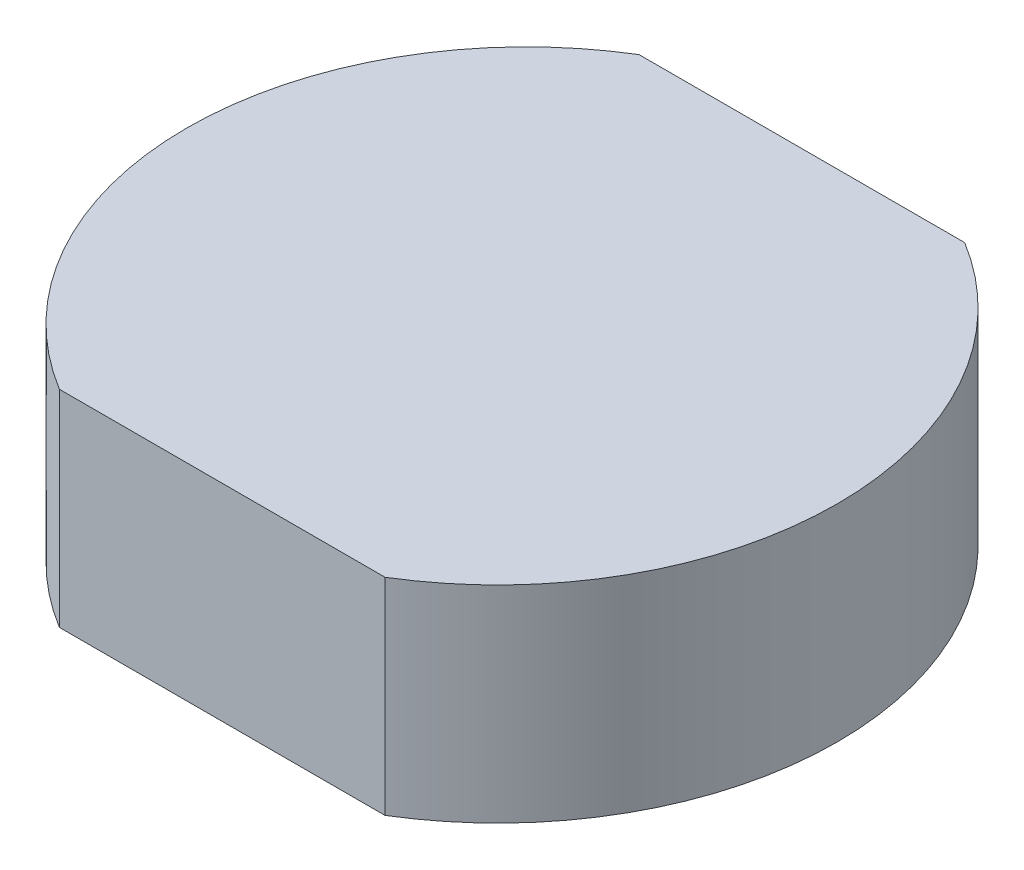
ISO-10303-21;
HEADER;
FILE_DESCRIPTION(('STEP AP214'),'2;1');
FILE_NAME('part.step','',(''),(''),'','','');
FILE_SCHEMA(('AUTOMOTIVE_DESIGN { 1 0 10303 214 1 1 1 1 }'));
ENDSEC;
DATA;
#1=APPLICATION_CONTEXT('core data for automotive mechanical design processes');
#2=APPLICATION_PROTOCOL_DEFINITION('international standard','automotive_design',2000,#1);
#3=PRODUCT_CONTEXT('',#1,'mechanical');
#4=PRODUCT('Part','Part','',(#3));
#5=PRODUCT_RELATED_PRODUCT_CATEGORY('part','',(#4));
#6=PRODUCT_DEFINITION_FORMATION('','',#4);
#7=PRODUCT_DEFINITION_CONTEXT('part definition',#1,'design');
#8=PRODUCT_DEFINITION('design','',#6,#7);
#9=PRODUCT_DEFINITION_SHAPE('','',#8);
#10=(LENGTH_UNIT() NAMED_UNIT(*) SI_UNIT(.MILLI.,.METRE.));
#11=(NAMED_UNIT(*) PLANE_ANGLE_UNIT() SI_UNIT($,.RADIAN.));
#12=(NAMED_UNIT(*) SI_UNIT($,.STERADIAN.) SOLID_ANGLE_UNIT());
#13=UNCERTAINTY_MEASURE_WITH_UNIT(LENGTH_MEASURE(1.E-05),#10,'distance_accuracy_value','');
#14=(GEOMETRIC_REPRESENTATION_CONTEXT(3) GLOBAL_UNCERTAINTY_ASSIGNED_CONTEXT((#13)) GLOBAL_UNIT_ASSIGNED_CONTEXT((#10,
#11,#12)) REPRESENTATION_CONTEXT('',''));
#15=CARTESIAN_POINT('',(0.,0.,0.));
#16=DIRECTION('',(0.,0.,1.));
#17=DIRECTION('',(1.,0.,0.));
#18=AXIS2_PLACEMENT_3D('',#15,#16,#17);
#19=CARTESIAN_POINT('',(0.,5.,-7.35));
#20=DIRECTION('',(0.,0.,1.));
#21=DIRECTION('',(1.,0.,0.));
#22=AXIS2_PLACEMENT_3D('',#19,#20,#21);
#23=PLANE('',#22);
#24=DIRECTION('',(-1.,0.,0.));
#25=VECTOR('',#24,1.);
#26=CARTESIAN_POINT('',(0.,0.,-7.35));
#27=LINE('',#26,#25);
#28=CARTESIAN_POINT('',(4.34763098818769,0.,-7.35));
#29=VERTEX_POINT('',#28);
#30=CARTESIAN_POINT('',(-4.34763098818769,0.,-7.35));
#31=VERTEX_POINT('',#30);
#32=EDGE_CURVE('E133',#29,#31,#27,.T.);
#33=ORIENTED_EDGE('',*,*,#32,.F.);
#34=DIRECTION('',(0.,-1.,0.));
#35=VECTOR('',#34,1.);
#36=CARTESIAN_POINT('',(4.34763098818769,5.,-7.35));
#37=LINE('',#36,#35);
#38=CARTESIAN_POINT('',(4.34763098818769,5.,-7.35));
#39=VERTEX_POINT('',#38);
#40=EDGE_CURVE('E144',#39,#29,#37,.T.);
#41=ORIENTED_EDGE('',*,*,#40,.F.);
#42=DIRECTION('',(-1.,0.,0.));
#43=VECTOR('',#42,1.);
#44=CARTESIAN_POINT('',(0.,5.,-7.35));
#45=LINE('',#44,#43);
#46=CARTESIAN_POINT('',(-4.34763098818769,5.,-7.35));
#47=VERTEX_POINT('',#46);
#48=EDGE_CURVE('E138',#39,#47,#45,.T.);
#49=ORIENTED_EDGE('',*,*,#48,.T.);
#50=DIRECTION('',(0.,-1.,0.));
#51=VECTOR('',#50,1.);
#52=CARTESIAN_POINT('',(-4.34763098818769,5.,-7.35));
#53=LINE('',#52,#51);
#54=EDGE_CURVE('E124',#47,#31,#53,.T.);
#55=ORIENTED_EDGE('',*,*,#54,.T.);
#56=EDGE_LOOP('',(#33,#41,#49,#55));
#57=FACE_BOUND('',#56,.T.);
#58=ADVANCED_FACE('F41',(#57),#23,.T.);
#59=CARTESIAN_POINT('',(-0.4,5.,0.));
#60=DIRECTION('',(0.,-1.,0.));
#61=DIRECTION('',(0.,0.,-1.));
#62=AXIS2_PLACEMENT_3D('',#59,#60,#61);
#63=CYLINDRICAL_SURFACE('',#62,8.75);
#64=CARTESIAN_POINT('',(-0.4,0.,0.));
#65=DIRECTION('',(0.,1.,0.));
#66=DIRECTION('',(0.,0.,1.));
#67=AXIS2_PLACEMENT_3D('',#64,#65,#66);
#68=CIRCLE('',#67,8.75);
#69=CARTESIAN_POINT('',(4.34763098818769,0.,7.35));
#70=VERTEX_POINT('',#69);
#71=EDGE_CURVE('E130',#29,#70,#68,.F.);
#72=ORIENTED_EDGE('',*,*,#71,.T.);
#73=DIRECTION('',(0.,-1.,0.));
#74=VECTOR('',#73,1.);
#75=CARTESIAN_POINT('',(4.34763098818769,5.,7.35));
#76=LINE('',#75,#74);
#77=CARTESIAN_POINT('',(4.34763098818769,5.,7.35));
#78=VERTEX_POINT('',#77);
#79=EDGE_CURVE('E123',#78,#70,#76,.T.);
#80=ORIENTED_EDGE('',*,*,#79,.F.);
#81=CARTESIAN_POINT('',(-0.4,5.,0.));
#82=DIRECTION('',(0.,1.,0.));
#83=DIRECTION('',(0.,0.,1.));
#84=AXIS2_PLACEMENT_3D('',#81,#82,#83);
#85=CIRCLE('',#84,8.75);
#86=EDGE_CURVE('E287',#39,#78,#85,.F.);
#87=ORIENTED_EDGE('',*,*,#86,.F.);
#88=ORIENTED_EDGE('',*,*,#40,.T.);
#89=EDGE_LOOP('',(#72,#80,#87,#88));
#90=FACE_BOUND('',#89,.T.);
#91=ADVANCED_FACE('F254',(#90),#63,.F.);
#92=CARTESIAN_POINT('',(0.,5.,7.35));
#93=DIRECTION('',(0.,0.,1.));
#94=DIRECTION('',(1.,0.,0.));
#95=AXIS2_PLACEMENT_3D('',#92,#93,#94);
#96=PLANE('',#95);
#97=DIRECTION('',(-1.,0.,0.));
#98=VECTOR('',#97,1.);
#99=CARTESIAN_POINT('',(0.,0.,7.35));
#100=LINE('',#99,#98);
#101=CARTESIAN_POINT('',(-4.34763098818769,0.,7.35));
#102=VERTEX_POINT('',#101);
#103=EDGE_CURVE('E107',#70,#102,#100,.T.);
#104=ORIENTED_EDGE('',*,*,#103,.T.);
#105=DIRECTION('',(0.,-1.,0.));
#106=VECTOR('',#105,1.);
#107=CARTESIAN_POINT('',(-4.34763098818769,5.,7.35));
#108=LINE('',#107,#106);
#109=CARTESIAN_POINT('',(-4.34763098818769,5.,7.35));
#110=VERTEX_POINT('',#109);
#111=EDGE_CURVE('E116',#110,#102,#108,.T.);
#112=ORIENTED_EDGE('',*,*,#111,.F.);
#113=DIRECTION('',(-1.,0.,0.));
#114=VECTOR('',#113,1.);
#115=CARTESIAN_POINT('',(0.,5.,7.35));
#116=LINE('',#115,#114);
#117=EDGE_CURVE('E72',#78,#110,#116,.T.);
#118=ORIENTED_EDGE('',*,*,#117,.F.);
#119=ORIENTED_EDGE('',*,*,#79,.T.);
#120=EDGE_LOOP('',(#104,#112,#118,#119));
#121=FACE_BOUND('',#120,.T.);
#122=ADVANCED_FACE('F126',(#121),#96,.F.);
#123=CARTESIAN_POINT('',(-0.399999999999998,5.,0.));
#124=DIRECTION('',(0.,-1.,0.));
#125=DIRECTION('',(0.,0.,-1.));
#126=AXIS2_PLACEMENT_3D('',#123,#124,#125);
#127=CYLINDRICAL_SURFACE('',#126,9.55);
#128=CARTESIAN_POINT('',(-0.399999999999998,0.,0.));
#129=DIRECTION('',(0.,1.,0.));
#130=DIRECTION('',(0.,0.,1.));
#131=AXIS2_PLACEMENT_3D('',#128,#129,#130);
#132=CIRCLE('',#131,9.55);
#133=CARTESIAN_POINT('',(4.57795138586146,0.,-8.15));
#134=VERTEX_POINT('',#133);
#135=CARTESIAN_POINT('',(4.57795138586146,0.,8.15));
#136=VERTEX_POINT('',#135);
#137=EDGE_CURVE('E273',#134,#136,#132,.F.);
#138=ORIENTED_EDGE('',*,*,#137,.F.);
#139=DIRECTION('',(0.,-1.,0.));
#140=VECTOR('',#139,1.);
#141=CARTESIAN_POINT('',(4.57795138586146,5.,-8.15));
#142=LINE('',#141,#140);
#143=CARTESIAN_POINT('',(4.57795138586146,5.8,-8.15));
#144=VERTEX_POINT('',#143);
#145=EDGE_CURVE('E140',#144,#134,#142,.T.);
#146=ORIENTED_EDGE('',*,*,#145,.F.);
#147=CARTESIAN_POINT('',(-0.399999999999998,5.8,0.));
#148=DIRECTION('',(0.,1.,0.));
#149=DIRECTION('',(0.,0.,1.));
#150=AXIS2_PLACEMENT_3D('',#147,#148,#149);
#151=CIRCLE('',#150,9.55);
#152=CARTESIAN_POINT('',(4.57795138586146,5.8,8.15));
#153=VERTEX_POINT('',#152);
#154=EDGE_CURVE('E226',#153,#144,#151,.T.);
#155=ORIENTED_EDGE('',*,*,#154,.F.);
#156=DIRECTION('',(0.,-1.,0.));
#157=VECTOR('',#156,1.);
#158=CARTESIAN_POINT('',(4.57795138586146,5.,8.15));
#159=LINE('',#158,#157);
#160=EDGE_CURVE('E147',#153,#136,#159,.T.);
#161=ORIENTED_EDGE('',*,*,#160,.T.);
#162=EDGE_LOOP('',(#138,#146,#155,#161));
#163=FACE_BOUND('',#162,.T.);
#164=ADVANCED_FACE('F43',(#163),#127,.T.);
#165=CARTESIAN_POINT('',(0.,5.,-8.15));
#166=DIRECTION('',(0.,0.,1.));
#167=DIRECTION('',(1.,0.,0.));
#168=AXIS2_PLACEMENT_3D('',#165,#166,#167);
#169=PLANE('',#168);
#170=DIRECTION('',(-1.,0.,0.));
#171=VECTOR('',#170,1.);
#172=CARTESIAN_POINT('',(0.,0.,-8.15));
#173=LINE('',#172,#171);
#174=CARTESIAN_POINT('',(-4.57795138586146,0.,-8.15));
#175=VERTEX_POINT('',#174);
#176=EDGE_CURVE('E193',#134,#175,#173,.T.);
#177=ORIENTED_EDGE('',*,*,#176,.T.);
#178=DIRECTION('',(0.,-1.,0.));
#179=VECTOR('',#178,1.);
#180=CARTESIAN_POINT('',(-4.57795138586146,5.,-8.15));
#181=LINE('',#180,#179);
#182=CARTESIAN_POINT('',(-4.57795138586146,5.8,-8.15));
#183=VERTEX_POINT('',#182);
#184=EDGE_CURVE('E154',#183,#175,#181,.T.);
#185=ORIENTED_EDGE('',*,*,#184,.F.);
#186=DIRECTION('',(-1.,0.,0.));
#187=VECTOR('',#186,1.);
#188=CARTESIAN_POINT('',(4.57795138586146,5.8,-8.15));
#189=LINE('',#188,#187);
#190=EDGE_CURVE('E294',#144,#183,#189,.T.);
#191=ORIENTED_EDGE('',*,*,#190,.F.);
#192=ORIENTED_EDGE('',*,*,#145,.T.);
#193=EDGE_LOOP('',(#177,#185,#191,#192));
#194=FACE_BOUND('',#193,.T.);
#195=ADVANCED_FACE('F264',(#194),#169,.F.);
#196=CARTESIAN_POINT('',(0.4,5.,0.));
#197=DIRECTION('',(0.,-1.,0.));
#198=DIRECTION('',(0.,0.,-1.));
#199=AXIS2_PLACEMENT_3D('',#196,#197,#198);
#200=CYLINDRICAL_SURFACE('',#199,9.55);
#201=DIRECTION('',(0.,-1.,0.));
#202=VECTOR('',#201,1.);
#203=CARTESIAN_POINT('',(-8.93822788327635,5.,-2.));
#204=LINE('',#203,#202);
#205=CARTESIAN_POINT('',(-8.93822788327635,0.,-2.));
#206=VERTEX_POINT('',#205);
#207=CARTESIAN_POINT('',(-8.93822788327635,2.,-2.));
#208=VERTEX_POINT('',#207);
#209=EDGE_CURVE('E182',#206,#208,#204,.F.);
#210=ORIENTED_EDGE('',*,*,#209,.T.);
#211=CARTESIAN_POINT('',(-8.93822788327635,2.,-2.));
#212=CARTESIAN_POINT('',(-8.93822486825092,2.05560879477302,-2.00000036184834));
#213=CARTESIAN_POINT('',(-8.93872523794376,2.11119032432689,-1.99767927484001));
#214=CARTESIAN_POINT('',(-8.94070135935251,2.22194327639065,-1.98842433688978));
#215=CARTESIAN_POINT('',(-8.94217698305452,2.27711475176407,-1.98149109134872));
#216=CARTESIAN_POINT('',(-8.9480101884345,2.44123044538608,-1.95386323888217));
#217=CARTESIAN_POINT('',(-8.95377441234414,2.54905576179998,-1.92634016485055));
#218=CARTESIAN_POINT('',(-8.96839168570942,2.75842403113251,-1.85393715224256));
#219=CARTESIAN_POINT('',(-8.97724496882663,2.85996650812245,-1.80905590063689));
#220=CARTESIAN_POINT('',(-8.99703817280008,3.05411485991313,-1.70324996807582));
#221=CARTESIAN_POINT('',(-9.00797836917944,3.14671955227585,-1.64232316831461));
#222=CARTESIAN_POINT('',(-9.03089982620546,3.3217482947518,-1.50516295019224));
#223=CARTESIAN_POINT('',(-9.0428933557936,3.40401446258239,-1.42873016684829));
#224=CARTESIAN_POINT('',(-9.06646363045983,3.55466457329786,-1.2631499127411));
#225=CARTESIAN_POINT('',(-9.07804031045156,3.623046355959,-1.17400046710408));
#226=CARTESIAN_POINT('',(-9.09960542494314,3.74459944136288,-0.984462618973189));
#227=CARTESIAN_POINT('',(-9.10957757562791,3.79761869750175,-0.883974697721508));
#228=CARTESIAN_POINT('',(-9.12667025628067,3.88595721594641,-0.675277844703432));
#229=CARTESIAN_POINT('',(-9.13379123170492,3.92127924341359,-0.567070122162898));
#230=CARTESIAN_POINT('',(-9.14429263783227,3.97272693677291,-0.347653080896291));
#231=CARTESIAN_POINT('',(-9.14772542683619,3.98912155710064,-0.23650937304115));
#232=CARTESIAN_POINT('',(-9.15064483269983,4.00308918003811,-0.0129970010083661));
#233=CARTESIAN_POINT('',(-9.15013177403693,4.00066373027132,0.0993715616874282));
#234=CARTESIAN_POINT('',(-9.14525743800698,3.97726152807406,0.320287358883396));
#235=CARTESIAN_POINT('',(-9.14095637404127,3.95657503776147,0.428866864664352));
#236=CARTESIAN_POINT('',(-9.12905759836421,3.89769958998791,0.640977560481181));
#237=CARTESIAN_POINT('',(-9.12145977108322,3.85951001894535,0.744508573398159));
#238=CARTESIAN_POINT('',(-9.10372297913134,3.76644897858461,0.944402889813852));
#239=CARTESIAN_POINT('',(-9.09356701337981,3.7114653564358,1.04071240986012));
#240=CARTESIAN_POINT('',(-9.07183104573758,3.58646180063714,1.22284153629522));
#241=CARTESIAN_POINT('',(-9.06025090872767,3.51644043980074,1.30866014580933));
#242=CARTESIAN_POINT('',(-9.03668297698071,3.36177287573369,1.46908938995847));
#243=CARTESIAN_POINT('',(-9.02469161657183,3.27687430304342,1.54345636440346));
#244=CARTESIAN_POINT('',(-9.00185677881069,3.09566114946264,1.67695906307126));
#245=CARTESIAN_POINT('',(-8.99101361803397,2.99934343558209,1.73609059306519));
#246=CARTESIAN_POINT('',(-8.97169273249096,2.79764005577222,1.83754208201197));
#247=CARTESIAN_POINT('',(-8.96322239433465,2.69222738051506,1.87980971306));
#248=CARTESIAN_POINT('',(-8.94971227862705,2.47564429002052,1.94590275189709));
#249=CARTESIAN_POINT('',(-8.94466739373727,2.36448271389182,1.96975562333392));
#250=CARTESIAN_POINT('',(-8.94050183135236,2.21034913390644,1.98935741380589));
#251=CARTESIAN_POINT('',(-8.93965009897194,2.16834650611947,1.99334965927315));
#252=CARTESIAN_POINT('',(-8.93851356211128,2.08423562470905,1.99866766131822));
#253=CARTESIAN_POINT('',(-8.93822781209978,2.04212766511776,1.99999786514667));
#254=CARTESIAN_POINT('',(-8.93822788327635,2.,2.));
#255=B_SPLINE_CURVE_WITH_KNOTS('',3,(#211,#212,#213,#214,#215,#216,#217,#218,#219,#220,#221,
#222,#223,#224,#225,#226,#227,#228,#229,#230,#231,#232,#233,#234,#235,#236,#237,#238,#239,#240,
#241,#242,#243,#244,#245,#246,#247,#248,#249,#250,#251,#252,#253,#254),.UNSPECIFIED.,.F.,.F.,(4,
2,2,2,2,2,2,2,2,2,2,2,2,2,2,2,2,2,2,2,2,4),(0.,0.166721917735341,0.33342195554627,
0.665993414396554,0.998590034960966,1.33123059676716,1.66845516693483,2.0057321645765,
2.34624138587768,2.68669738659654,3.0222536074862,3.35778223500442,3.6880717246996,
4.0183727937875,4.35092975718292,4.68351829651837,5.02241976860288,5.36141443883814,
5.70145296240878,6.04098336986094,6.16751669938177,6.29383846317846),.UNSPECIFIED.);
#256=CARTESIAN_POINT('',(-8.93822788327635,2.,2.));
#257=VERTEX_POINT('',#256);
#258=EDGE_CURVE('E213',#208,#257,#255,.T.);
#259=ORIENTED_EDGE('',*,*,#258,.T.);
#260=DIRECTION('',(0.,-1.,0.));
#261=VECTOR('',#260,1.);
#262=CARTESIAN_POINT('',(-8.93822788327635,5.,2.));
#263=LINE('',#262,#261);
#264=CARTESIAN_POINT('',(-8.93822788327635,0.,2.));
#265=VERTEX_POINT('',#264);
#266=EDGE_CURVE('E209',#257,#265,#263,.T.);
#267=ORIENTED_EDGE('',*,*,#266,.T.);
#268=CARTESIAN_POINT('',(0.4,0.,0.));
#269=DIRECTION('',(0.,1.,0.));
#270=DIRECTION('',(0.,0.,1.));
#271=AXIS2_PLACEMENT_3D('',#268,#269,#270);
#272=CIRCLE('',#271,9.55);
#273=CARTESIAN_POINT('',(-4.57795138586146,0.,8.15));
#274=VERTEX_POINT('',#273);
#275=EDGE_CURVE('E187',#265,#274,#272,.T.);
#276=ORIENTED_EDGE('',*,*,#275,.T.);
#277=DIRECTION('',(0.,-1.,0.));
#278=VECTOR('',#277,1.);
#279=CARTESIAN_POINT('',(-4.57795138586146,5.,8.15));
#280=LINE('',#279,#278);
#281=CARTESIAN_POINT('',(-4.57795138586146,5.8,8.15));
#282=VERTEX_POINT('',#281);
#283=EDGE_CURVE('E150',#282,#274,#280,.T.);
#284=ORIENTED_EDGE('',*,*,#283,.F.);
#285=CARTESIAN_POINT('',(0.4,5.8,0.));
#286=DIRECTION('',(0.,1.,0.));
#287=DIRECTION('',(0.,0.,1.));
#288=AXIS2_PLACEMENT_3D('',#285,#286,#287);
#289=CIRCLE('',#288,9.55);
#290=EDGE_CURVE('E280',#183,#282,#289,.T.);
#291=ORIENTED_EDGE('',*,*,#290,.F.);
#292=ORIENTED_EDGE('',*,*,#184,.T.);
#293=EDGE_CURVE('E168',#175,#206,#272,.T.);
#294=ORIENTED_EDGE('',*,*,#293,.T.);
#295=EDGE_LOOP('',(#210,#259,#267,#276,#284,#291,#292,#294));
#296=FACE_BOUND('',#295,.T.);
#297=ADVANCED_FACE('F179',(#296),#200,.T.);
#298=CARTESIAN_POINT('',(0.,5.,8.15));
#299=DIRECTION('',(0.,0.,1.));
#300=DIRECTION('',(1.,0.,0.));
#301=AXIS2_PLACEMENT_3D('',#298,#299,#300);
#302=PLANE('',#301);
#303=DIRECTION('',(-1.,0.,0.));
#304=VECTOR('',#303,1.);
#305=CARTESIAN_POINT('',(0.,0.,8.15));
#306=LINE('',#305,#304);
#307=EDGE_CURVE('E186',#136,#274,#306,.T.);
#308=ORIENTED_EDGE('',*,*,#307,.F.);
#309=ORIENTED_EDGE('',*,*,#160,.F.);
#310=DIRECTION('',(1.,0.,0.));
#311=VECTOR('',#310,1.);
#312=CARTESIAN_POINT('',(4.57795138586146,5.8,8.15));
#313=LINE('',#312,#311);
#314=EDGE_CURVE('E277',#282,#153,#313,.T.);
#315=ORIENTED_EDGE('',*,*,#314,.F.);
#316=ORIENTED_EDGE('',*,*,#283,.T.);
#317=EDGE_LOOP('',(#308,#309,#315,#316));
#318=FACE_BOUND('',#317,.T.);
#319=ADVANCED_FACE('F251',(#318),#302,.T.);
#320=CARTESIAN_POINT('',(0.4,5.,0.));
#321=DIRECTION('',(0.,-1.,0.));
#322=DIRECTION('',(0.,0.,-1.));
#323=AXIS2_PLACEMENT_3D('',#320,#321,#322);
#324=CYLINDRICAL_SURFACE('',#323,8.75);
#325=DIRECTION('',(0.,-1.,0.));
#326=VECTOR('',#325,1.);
#327=CARTESIAN_POINT('',(-8.11836251870041,5.,-2.));
#328=LINE('',#327,#326);
#329=CARTESIAN_POINT('',(-8.11836251870041,0.,-2.));
#330=VERTEX_POINT('',#329);
#331=CARTESIAN_POINT('',(-8.11836251870041,2.,-2.));
#332=VERTEX_POINT('',#331);
#333=EDGE_CURVE('E203',#330,#332,#328,.F.);
#334=ORIENTED_EDGE('',*,*,#333,.F.);
#335=CARTESIAN_POINT('',(0.4,0.,0.));
#336=DIRECTION('',(0.,1.,0.));
#337=DIRECTION('',(0.,0.,1.));
#338=AXIS2_PLACEMENT_3D('',#335,#336,#337);
#339=CIRCLE('',#338,8.75);
#340=EDGE_CURVE('E113',#31,#330,#339,.T.);
#341=ORIENTED_EDGE('',*,*,#340,.F.);
#342=ORIENTED_EDGE('',*,*,#54,.F.);
#343=CARTESIAN_POINT('',(0.4,5.,0.));
#344=DIRECTION('',(0.,1.,0.));
#345=DIRECTION('',(0.,0.,1.));
#346=AXIS2_PLACEMENT_3D('',#343,#344,#345);
#347=CIRCLE('',#346,8.75);
#348=EDGE_CURVE('E120',#47,#110,#347,.T.);
#349=ORIENTED_EDGE('',*,*,#348,.T.);
#350=ORIENTED_EDGE('',*,*,#111,.T.);
#351=CARTESIAN_POINT('',(-8.11836251870041,0.,2.));
#352=VERTEX_POINT('',#351);
#353=EDGE_CURVE('E101',#352,#102,#339,.T.);
#354=ORIENTED_EDGE('',*,*,#353,.F.);
#355=DIRECTION('',(0.,-1.,0.));
#356=VECTOR('',#355,1.);
#357=CARTESIAN_POINT('',(-8.11836251870041,5.,2.));
#358=LINE('',#357,#356);
#359=CARTESIAN_POINT('',(-8.11836251870041,2.,2.));
#360=VERTEX_POINT('',#359);
#361=EDGE_CURVE('E63',#360,#352,#358,.T.);
#362=ORIENTED_EDGE('',*,*,#361,.F.);
#363=CARTESIAN_POINT('',(-8.11836251870041,2.,-2.));
#364=CARTESIAN_POINT('',(-8.11835917838469,2.05548175300803,-2.00000050266384));
#365=CARTESIAN_POINT('',(-8.11890525350059,2.11093617514396,-1.99768986347888));
#366=CARTESIAN_POINT('',(-8.12106157520753,2.22143337112418,-1.98847752940087));
#367=CARTESIAN_POINT('',(-8.12267166453848,2.27647620458518,-1.98157651295933));
#368=CARTESIAN_POINT('',(-8.12903495084886,2.44018647970477,-1.95408242842761));
#369=CARTESIAN_POINT('',(-8.13532152988091,2.54773384637295,-1.92669793578136));
#370=CARTESIAN_POINT('',(-8.1512566325229,2.75654883000984,-1.85468365036888));
#371=CARTESIAN_POINT('',(-8.16090515516091,2.85781644879398,-1.81005386258816));
#372=CARTESIAN_POINT('',(-8.18247170274814,3.05146878256163,-1.70486148546086));
#373=CARTESIAN_POINT('',(-8.19439016681141,3.14385177362542,-1.64429581249392));
#374=CARTESIAN_POINT('',(-8.21939644573314,3.31875904564063,-1.50777514097396));
#375=CARTESIAN_POINT('',(-8.23250026006489,3.40109633723177,-1.43158356992986));
#376=CARTESIAN_POINT('',(-8.25826235355102,3.55194815342227,-1.26647651771232));
#377=CARTESIAN_POINT('',(-8.27092056235824,3.62046050350332,-1.17755903864066));
#378=CARTESIAN_POINT('',(-8.2945404907688,3.74246059713096,-0.988257960556859));
#379=CARTESIAN_POINT('',(-8.30548097653214,3.79576607798807,-0.887754022818379));
#380=CARTESIAN_POINT('',(-8.32424963525996,3.88465634225279,-0.678927441346971));
#381=CARTESIAN_POINT('',(-8.3320783509393,3.92024421601081,-0.570606164910781));
#382=CARTESIAN_POINT('',(-8.34362833476775,3.97209752199713,-0.351174477398311));
#383=CARTESIAN_POINT('',(-8.34741733829086,3.98868195839048,-0.240143075261025));
#384=CARTESIAN_POINT('',(-8.35069611823789,4.00305632671401,-0.0168111304958133));
#385=CARTESIAN_POINT('',(-8.35018633248114,4.00084817261531,0.0954892817236804));
#386=CARTESIAN_POINT('',(-8.34497616891323,3.97793445617929,0.31596301443546));
#387=CARTESIAN_POINT('',(-8.34035382435722,3.95757332062519,0.42417424839087));
#388=CARTESIAN_POINT('',(-8.32752745747229,3.89948209438454,0.635600975752848));
#389=CARTESIAN_POINT('',(-8.31932329324628,3.86175131558041,0.73881627106075));
#390=CARTESIAN_POINT('',(-8.30013132566138,3.76969456854183,0.938264990930978));
#391=CARTESIAN_POINT('',(-8.28912210589172,3.71524022874154,1.03443701920271));
#392=CARTESIAN_POINT('',(-8.26552380241102,3.59137958541502,1.21639958202374));
#393=CARTESIAN_POINT('',(-8.25293452837502,3.52197147991454,1.30218886347299));
#394=CARTESIAN_POINT('',(-8.22722067353005,3.36831676587726,1.46299467423456));
#395=CARTESIAN_POINT('',(-8.21409042442845,3.2837704174783,1.5377241211863));
#396=CARTESIAN_POINT('',(-8.18903565618427,3.10318306651719,1.67201933650568));
#397=CARTESIAN_POINT('',(-8.17711146711442,3.00713893287754,1.73158096049865));
#398=CARTESIAN_POINT('',(-8.15579990550757,2.80577370365954,1.83399725787648));
#399=CARTESIAN_POINT('',(-8.14642293392448,2.70041683368996,1.87678373985823));
#400=CARTESIAN_POINT('',(-8.13141024736514,2.48380710490725,1.94389862966227));
#401=CARTESIAN_POINT('',(-8.12576895933787,2.37256329746126,1.96825454077463));
#402=CARTESIAN_POINT('',(-8.12101529760461,2.21699058416559,1.98867280641246));
#403=CARTESIAN_POINT('',(-8.12002183030915,2.17367034663409,1.99292160041828));
#404=CARTESIAN_POINT('',(-8.11869585809928,2.086906777183,1.99858182354701));
#405=CARTESIAN_POINT('',(-8.11836226256761,2.04346376741526,1.99999793449147));
#406=CARTESIAN_POINT('',(-8.11836251870041,2.,2.));
#407=B_SPLINE_CURVE_WITH_KNOTS('',3,(#363,#364,#365,#366,#367,#368,#369,#370,#371,#372,#373,
#374,#375,#376,#377,#378,#379,#380,#381,#382,#383,#384,#385,#386,#387,#388,#389,#390,#391,#392,
#393,#394,#395,#396,#397,#398,#399,#400,#401,#402,#403,#404,#405,#406),.UNSPECIFIED.,.F.,.F.,(4,
2,2,2,2,2,2,2,2,2,2,2,2,2,2,2,2,2,2,2,2,4),(0.,0.166340623933349,0.332656668410424,
0.664405934543824,0.996155104770762,1.32796851628531,1.66523548607553,2.00255546314329,
2.3437631322482,2.68491126616841,3.02024467018604,3.35554392187295,3.68461362662632,
4.013696368961,4.3453711386236,4.67708589848175,5.01629289286637,5.3555924711479,
5.69625735495661,6.03641286860187,6.16695444699691,6.29728008911352),.UNSPECIFIED.);
#408=EDGE_CURVE('E11',#332,#360,#407,.T.);
#409=ORIENTED_EDGE('',*,*,#408,.F.);
#410=EDGE_LOOP('',(#334,#341,#342,#349,#350,#354,#362,#409));
#411=FACE_BOUND('',#410,.T.);
#412=ADVANCED_FACE('F118',(#411),#324,.F.);
#413=CARTESIAN_POINT('',(0.,0.,0.));
#414=DIRECTION('',(0.,1.,0.));
#415=DIRECTION('',(0.,0.,1.));
#416=AXIS2_PLACEMENT_3D('',#413,#414,#415);
#417=PLANE('',#416);
#418=ORIENTED_EDGE('',*,*,#340,.T.);
#419=DIRECTION('',(-1.,0.,0.));
#420=VECTOR('',#419,1.);
#421=CARTESIAN_POINT('',(0.,0.,-2.));
#422=LINE('',#421,#420);
#423=EDGE_CURVE('E56',#330,#206,#422,.T.);
#424=ORIENTED_EDGE('',*,*,#423,.T.);
#425=ORIENTED_EDGE('',*,*,#293,.F.);
#426=ORIENTED_EDGE('',*,*,#176,.F.);
#427=ORIENTED_EDGE('',*,*,#137,.T.);
#428=ORIENTED_EDGE('',*,*,#307,.T.);
#429=ORIENTED_EDGE('',*,*,#275,.F.);
#430=DIRECTION('',(1.,0.,0.));
#431=VECTOR('',#430,1.);
#432=CARTESIAN_POINT('',(0.,0.,2.));
#433=LINE('',#432,#431);
#434=EDGE_CURVE('E110',#265,#352,#433,.T.);
#435=ORIENTED_EDGE('',*,*,#434,.T.);
#436=ORIENTED_EDGE('',*,*,#353,.T.);
#437=ORIENTED_EDGE('',*,*,#103,.F.);
#438=ORIENTED_EDGE('',*,*,#71,.F.);
#439=ORIENTED_EDGE('',*,*,#32,.T.);
#440=EDGE_LOOP('',(#418,#424,#425,#426,#427,#428,#429,#435,#436,#437,#438,#439));
#441=FACE_BOUND('',#440,.T.);
#442=ADVANCED_FACE('F104',(#441),#417,.F.);
#443=CARTESIAN_POINT('',(-0.399999999999998,5.,0.));
#444=DIRECTION('',(0.,1.,0.));
#445=DIRECTION('',(0.,0.,1.));
#446=AXIS2_PLACEMENT_3D('',#443,#444,#445);
#447=PLANE('',#446);
#448=ORIENTED_EDGE('',*,*,#48,.F.);
#449=ORIENTED_EDGE('',*,*,#86,.T.);
#450=ORIENTED_EDGE('',*,*,#117,.T.);
#451=ORIENTED_EDGE('',*,*,#348,.F.);
#452=EDGE_LOOP('',(#448,#449,#450,#451));
#453=FACE_BOUND('',#452,.T.);
#454=ADVANCED_FACE('F243',(#453),#447,.F.);
#455=CARTESIAN_POINT('',(-0.399999999999998,5.8,0.));
#456=DIRECTION('',(0.,1.,0.));
#457=DIRECTION('',(0.,0.,1.));
#458=AXIS2_PLACEMENT_3D('',#455,#456,#457);
#459=PLANE('',#458);
#460=ORIENTED_EDGE('',*,*,#154,.T.);
#461=ORIENTED_EDGE('',*,*,#190,.T.);
#462=ORIENTED_EDGE('',*,*,#290,.T.);
#463=ORIENTED_EDGE('',*,*,#314,.T.);
#464=EDGE_LOOP('',(#460,#461,#462,#463));
#465=FACE_BOUND('',#464,.T.);
#466=ADVANCED_FACE('F236',(#465),#459,.T.);
#467=CARTESIAN_POINT('',(-9.15,2.,0.));
#468=DIRECTION('',(1.,0.,0.));
#469=DIRECTION('',(0.,0.,-1.));
#470=AXIS2_PLACEMENT_3D('',#467,#468,#469);
#471=CYLINDRICAL_SURFACE('',#470,2.);
#472=DIRECTION('',(1.,0.,0.));
#473=VECTOR('',#472,1.);
#474=CARTESIAN_POINT('',(-9.15,2.,-2.));
#475=LINE('',#474,#473);
#476=EDGE_CURVE('E324',#208,#332,#475,.T.);
#477=ORIENTED_EDGE('',*,*,#476,.T.);
#478=ORIENTED_EDGE('',*,*,#408,.T.);
#479=DIRECTION('',(1.,0.,0.));
#480=VECTOR('',#479,1.);
#481=CARTESIAN_POINT('',(-9.15,2.,2.));
#482=LINE('',#481,#480);
#483=EDGE_CURVE('E322',#257,#360,#482,.T.);
#484=ORIENTED_EDGE('',*,*,#483,.F.);
#485=ORIENTED_EDGE('',*,*,#258,.F.);
#486=EDGE_LOOP('',(#477,#478,#484,#485));
#487=FACE_BOUND('',#486,.T.);
#488=ADVANCED_FACE('F230',(#487),#471,.F.);
#489=CARTESIAN_POINT('',(-9.15,2.,-2.));
#490=DIRECTION('',(0.,0.,-1.));
#491=DIRECTION('',(-1.,0.,0.));
#492=AXIS2_PLACEMENT_3D('',#489,#490,#491);
#493=PLANE('',#492);
#494=ORIENTED_EDGE('',*,*,#423,.F.);
#495=ORIENTED_EDGE('',*,*,#333,.T.);
#496=ORIENTED_EDGE('',*,*,#476,.F.);
#497=ORIENTED_EDGE('',*,*,#209,.F.);
#498=EDGE_LOOP('',(#494,#495,#496,#497));
#499=FACE_BOUND('',#498,.T.);
#500=ADVANCED_FACE('F235',(#499),#493,.F.);
#501=CARTESIAN_POINT('',(-9.15,2.,2.));
#502=DIRECTION('',(0.,0.,1.));
#503=DIRECTION('',(1.,0.,0.));
#504=AXIS2_PLACEMENT_3D('',#501,#502,#503);
#505=PLANE('',#504);
#506=ORIENTED_EDGE('',*,*,#483,.T.);
#507=ORIENTED_EDGE('',*,*,#361,.T.);
#508=ORIENTED_EDGE('',*,*,#434,.F.);
#509=ORIENTED_EDGE('',*,*,#266,.F.);
#510=EDGE_LOOP('',(#506,#507,#508,#509));
#511=FACE_BOUND('',#510,.T.);
#512=ADVANCED_FACE('F238',(#511),#505,.F.);
#513=CLOSED_SHELL('',(#58,#91,#122,#164,#195,#297,#319,#412,#442,#454,#466,#488,#500,#512));
#514=MANIFOLD_SOLID_BREP('B2',#513);
#515=ADVANCED_BREP_SHAPE_REPRESENTATION('',(#18,#514),#14);
#516=SHAPE_DEFINITION_REPRESENTATION(#9,#515);
ENDSEC;
END-ISO-10303-21;
